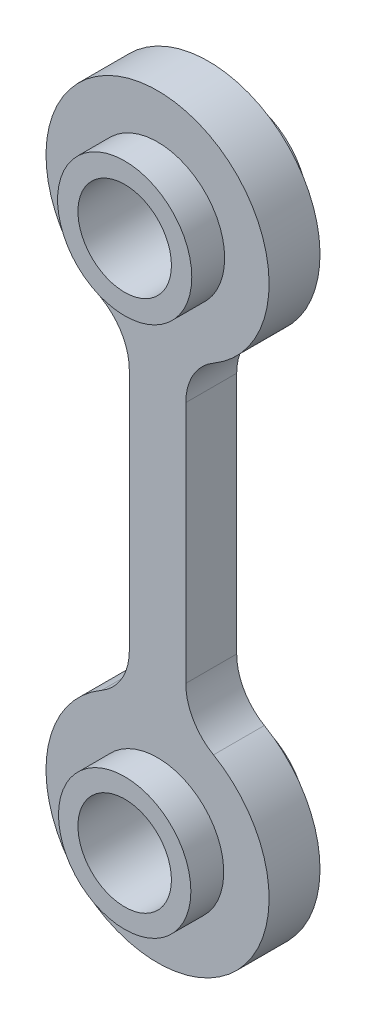
ISO-10303-21;
HEADER;
FILE_DESCRIPTION(('STEP AP214'),'2;1');
FILE_NAME('part.step','',(''),(''),'','','');
FILE_SCHEMA(('AUTOMOTIVE_DESIGN { 1 0 10303 214 1 1 1 1 }'));
ENDSEC;
DATA;
#1=APPLICATION_CONTEXT('core data for automotive mechanical design processes');
#2=APPLICATION_PROTOCOL_DEFINITION('international standard','automotive_design',2000,#1);
#3=PRODUCT_CONTEXT('',#1,'mechanical');
#4=PRODUCT('Part','Part','',(#3));
#5=PRODUCT_RELATED_PRODUCT_CATEGORY('part','',(#4));
#6=PRODUCT_DEFINITION_FORMATION('','',#4);
#7=PRODUCT_DEFINITION_CONTEXT('part definition',#1,'design');
#8=PRODUCT_DEFINITION('design','',#6,#7);
#9=PRODUCT_DEFINITION_SHAPE('','',#8);
#10=(LENGTH_UNIT() NAMED_UNIT(*) SI_UNIT(.MILLI.,.METRE.));
#11=(NAMED_UNIT(*) PLANE_ANGLE_UNIT() SI_UNIT($,.RADIAN.));
#12=(NAMED_UNIT(*) SI_UNIT($,.STERADIAN.) SOLID_ANGLE_UNIT());
#13=UNCERTAINTY_MEASURE_WITH_UNIT(LENGTH_MEASURE(1.E-05),#10,'distance_accuracy_value','');
#14=(GEOMETRIC_REPRESENTATION_CONTEXT(3) GLOBAL_UNCERTAINTY_ASSIGNED_CONTEXT((#13)) GLOBAL_UNIT_ASSIGNED_CONTEXT((#10,
#11,#12)) REPRESENTATION_CONTEXT('',''));
#15=CARTESIAN_POINT('',(0.,0.,0.));
#16=DIRECTION('',(0.,0.,1.));
#17=DIRECTION('',(1.,0.,0.));
#18=AXIS2_PLACEMENT_3D('',#15,#16,#17);
#19=CARTESIAN_POINT('',(0.,0.,12.6));
#20=DIRECTION('',(0.,0.,-1.));
#21=DIRECTION('',(-1.,0.,0.));
#22=AXIS2_PLACEMENT_3D('',#19,#20,#21);
#23=CYLINDRICAL_SURFACE('',#22,7.15);
#24=CARTESIAN_POINT('',(0.,0.,0.));
#25=DIRECTION('',(0.,0.,1.));
#26=DIRECTION('',(1.,0.,0.));
#27=AXIS2_PLACEMENT_3D('',#24,#25,#26);
#28=CIRCLE('',#27,7.15);
#29=CARTESIAN_POINT('',(7.15,0.,0.));
#30=VERTEX_POINT('',#29);
#31=EDGE_CURVE('E212',#30,#30,#28,.T.);
#32=ORIENTED_EDGE('',*,*,#31,.T.);
#33=EDGE_LOOP('',(#32));
#34=FACE_BOUND('',#33,.T.);
#35=CARTESIAN_POINT('',(0.,0.,3.55));
#36=DIRECTION('',(0.,0.,1.));
#37=DIRECTION('',(1.,0.,0.));
#38=AXIS2_PLACEMENT_3D('',#35,#36,#37);
#39=CIRCLE('',#38,7.15);
#40=CARTESIAN_POINT('',(7.15,0.,3.55));
#41=VERTEX_POINT('',#40);
#42=EDGE_CURVE('E48',#41,#41,#39,.T.);
#43=ORIENTED_EDGE('',*,*,#42,.F.);
#44=EDGE_LOOP('',(#43));
#45=FACE_BOUND('',#44,.T.);
#46=ADVANCED_FACE('F39',(#34,#45),#23,.T.);
#47=CARTESIAN_POINT('',(0.,0.,12.6));
#48=DIRECTION('',(0.,0.,1.));
#49=DIRECTION('',(1.,0.,0.));
#50=AXIS2_PLACEMENT_3D('',#47,#48,#49);
#51=PLANE('',#50);
#52=CARTESIAN_POINT('',(0.,0.,12.6));
#53=DIRECTION('',(0.,0.,1.));
#54=DIRECTION('',(1.,0.,0.));
#55=AXIS2_PLACEMENT_3D('',#52,#53,#54);
#56=CIRCLE('',#55,7.15);
#57=CARTESIAN_POINT('',(7.15,0.,12.6));
#58=VERTEX_POINT('',#57);
#59=EDGE_CURVE('E216',#58,#58,#56,.T.);
#60=ORIENTED_EDGE('',*,*,#59,.T.);
#61=EDGE_LOOP('',(#60));
#62=FACE_BOUND('',#61,.T.);
#63=CARTESIAN_POINT('',(0.,0.,12.6));
#64=DIRECTION('',(0.,0.,1.));
#65=DIRECTION('',(1.,0.,0.));
#66=AXIS2_PLACEMENT_3D('',#63,#64,#65);
#67=CIRCLE('',#66,5.05);
#68=CARTESIAN_POINT('',(5.05,0.,12.6));
#69=VERTEX_POINT('',#68);
#70=EDGE_CURVE('E208',#69,#69,#67,.T.);
#71=ORIENTED_EDGE('',*,*,#70,.F.);
#72=EDGE_LOOP('',(#71));
#73=FACE_BOUND('',#72,.T.);
#74=ADVANCED_FACE('F227',(#62,#73),#51,.T.);
#75=CARTESIAN_POINT('',(0.,0.,0.));
#76=DIRECTION('',(0.,0.,1.));
#77=DIRECTION('',(1.,0.,0.));
#78=AXIS2_PLACEMENT_3D('',#75,#76,#77);
#79=PLANE('',#78);
#80=ORIENTED_EDGE('',*,*,#31,.F.);
#81=EDGE_LOOP('',(#80));
#82=FACE_BOUND('',#81,.T.);
#83=CARTESIAN_POINT('',(0.,0.,0.));
#84=DIRECTION('',(0.,0.,1.));
#85=DIRECTION('',(1.,0.,0.));
#86=AXIS2_PLACEMENT_3D('',#83,#84,#85);
#87=CIRCLE('',#86,5.05);
#88=CARTESIAN_POINT('',(5.05,0.,0.));
#89=VERTEX_POINT('',#88);
#90=EDGE_CURVE('E191',#89,#89,#87,.T.);
#91=ORIENTED_EDGE('',*,*,#90,.T.);
#92=EDGE_LOOP('',(#91));
#93=FACE_BOUND('',#92,.T.);
#94=ADVANCED_FACE('F232',(#82,#93),#79,.F.);
#95=CARTESIAN_POINT('',(0.,0.,9.05));
#96=DIRECTION('',(0.,0.,-1.));
#97=DIRECTION('',(-1.,0.,0.));
#98=AXIS2_PLACEMENT_3D('',#95,#96,#97);
#99=CIRCLE('',#98,7.15);
#100=CARTESIAN_POINT('',(-7.15,0.,9.05));
#101=VERTEX_POINT('',#100);
#102=EDGE_CURVE('E159',#101,#101,#99,.T.);
#103=ORIENTED_EDGE('',*,*,#102,.F.);
#104=EDGE_LOOP('',(#103));
#105=FACE_BOUND('',#104,.T.);
#106=ORIENTED_EDGE('',*,*,#59,.F.);
#107=EDGE_LOOP('',(#106));
#108=FACE_BOUND('',#107,.T.);
#109=ADVANCED_FACE('F41',(#105,#108),#23,.T.);
#110=CARTESIAN_POINT('',(0.,0.,12.6));
#111=DIRECTION('',(0.,0.,-1.));
#112=DIRECTION('',(-1.,0.,0.));
#113=AXIS2_PLACEMENT_3D('',#110,#111,#112);
#114=CYLINDRICAL_SURFACE('',#113,5.05);
#115=ORIENTED_EDGE('',*,*,#70,.T.);
#116=EDGE_LOOP('',(#115));
#117=FACE_BOUND('',#116,.T.);
#118=ORIENTED_EDGE('',*,*,#90,.F.);
#119=EDGE_LOOP('',(#118));
#120=FACE_BOUND('',#119,.T.);
#121=ADVANCED_FACE('F236',(#117,#120),#114,.F.);
#122=CARTESIAN_POINT('',(-9.05,41.8827018982156,9.05));
#123=DIRECTION('',(0.,0.,-1.));
#124=DIRECTION('',(-1.,0.,0.));
#125=AXIS2_PLACEMENT_3D('',#122,#123,#124);
#126=CYLINDRICAL_SURFACE('',#125,6.);
#127=DIRECTION('',(0.,0.,-1.));
#128=VECTOR('',#127,1.);
#129=CARTESIAN_POINT('',(-6.04168975069252,47.0740475276176,9.05));
#130=LINE('',#129,#128);
#131=CARTESIAN_POINT('',(-6.04168975069252,47.0740475276176,9.05));
#132=VERTEX_POINT('',#131);
#133=CARTESIAN_POINT('',(-6.04168975069252,47.0740475276176,3.55));
#134=VERTEX_POINT('',#133);
#135=EDGE_CURVE('E104',#132,#134,#130,.T.);
#136=ORIENTED_EDGE('',*,*,#135,.T.);
#137=CARTESIAN_POINT('',(-9.05,41.8827018982156,3.55));
#138=DIRECTION('',(0.,0.,1.));
#139=DIRECTION('',(1.,0.,0.));
#140=AXIS2_PLACEMENT_3D('',#137,#138,#139);
#141=CIRCLE('',#140,6.);
#142=CARTESIAN_POINT('',(-3.05,41.8827018982156,3.55));
#143=VERTEX_POINT('',#142);
#144=EDGE_CURVE('E108',#143,#134,#141,.T.);
#145=ORIENTED_EDGE('',*,*,#144,.F.);
#146=DIRECTION('',(0.,0.,-1.));
#147=VECTOR('',#146,1.);
#148=CARTESIAN_POINT('',(-3.05,41.8827018982156,9.05));
#149=LINE('',#148,#147);
#150=CARTESIAN_POINT('',(-3.05,41.8827018982156,9.05));
#151=VERTEX_POINT('',#150);
#152=EDGE_CURVE('E55',#151,#143,#149,.T.);
#153=ORIENTED_EDGE('',*,*,#152,.F.);
#154=CARTESIAN_POINT('',(-9.05,41.8827018982156,9.05));
#155=DIRECTION('',(0.,0.,1.));
#156=DIRECTION('',(1.,0.,0.));
#157=AXIS2_PLACEMENT_3D('',#154,#155,#156);
#158=CIRCLE('',#157,6.);
#159=EDGE_CURVE('E109',#151,#132,#158,.T.);
#160=ORIENTED_EDGE('',*,*,#159,.T.);
#161=EDGE_LOOP('',(#136,#145,#153,#160));
#162=FACE_BOUND('',#161,.T.);
#163=ADVANCED_FACE('F106',(#162),#126,.F.);
#164=CARTESIAN_POINT('',(-3.05,15.6172981017844,9.05));
#165=DIRECTION('',(-1.,0.,0.));
#166=DIRECTION('',(0.,0.,1.));
#167=AXIS2_PLACEMENT_3D('',#164,#165,#166);
#168=PLANE('',#167);
#169=ORIENTED_EDGE('',*,*,#152,.T.);
#170=DIRECTION('',(0.,1.,0.));
#171=VECTOR('',#170,1.);
#172=CARTESIAN_POINT('',(-3.05,15.6172981017844,3.55));
#173=LINE('',#172,#171);
#174=CARTESIAN_POINT('',(-3.05,15.6172981017844,3.55));
#175=VERTEX_POINT('',#174);
#176=EDGE_CURVE('E130',#175,#143,#173,.T.);
#177=ORIENTED_EDGE('',*,*,#176,.F.);
#178=DIRECTION('',(0.,0.,-1.));
#179=VECTOR('',#178,1.);
#180=CARTESIAN_POINT('',(-3.05,15.6172981017844,9.05));
#181=LINE('',#180,#179);
#182=CARTESIAN_POINT('',(-3.05,15.6172981017844,9.05));
#183=VERTEX_POINT('',#182);
#184=EDGE_CURVE('E63',#183,#175,#181,.T.);
#185=ORIENTED_EDGE('',*,*,#184,.F.);
#186=DIRECTION('',(0.,1.,0.));
#187=VECTOR('',#186,1.);
#188=CARTESIAN_POINT('',(-3.05,15.6172981017844,9.05));
#189=LINE('',#188,#187);
#190=EDGE_CURVE('E115',#183,#151,#189,.T.);
#191=ORIENTED_EDGE('',*,*,#190,.T.);
#192=EDGE_LOOP('',(#169,#177,#185,#191));
#193=FACE_BOUND('',#192,.T.);
#194=ADVANCED_FACE('F262',(#193),#168,.T.);
#195=CARTESIAN_POINT('',(-9.05,15.6172981017844,9.05));
#196=DIRECTION('',(0.,0.,-1.));
#197=DIRECTION('',(-1.,0.,0.));
#198=AXIS2_PLACEMENT_3D('',#195,#196,#197);
#199=CYLINDRICAL_SURFACE('',#198,6.);
#200=ORIENTED_EDGE('',*,*,#184,.T.);
#201=CARTESIAN_POINT('',(-9.05,15.6172981017844,3.55));
#202=DIRECTION('',(0.,0.,1.));
#203=DIRECTION('',(-1.,0.,0.));
#204=AXIS2_PLACEMENT_3D('',#201,#202,#203);
#205=CIRCLE('',#204,6.);
#206=CARTESIAN_POINT('',(-6.04168975069252,10.4259524723824,3.55));
#207=VERTEX_POINT('',#206);
#208=EDGE_CURVE('E154',#207,#175,#205,.T.);
#209=ORIENTED_EDGE('',*,*,#208,.F.);
#210=DIRECTION('',(0.,0.,-1.));
#211=VECTOR('',#210,1.);
#212=CARTESIAN_POINT('',(-6.04168975069252,10.4259524723824,9.05));
#213=LINE('',#212,#211);
#214=CARTESIAN_POINT('',(-6.04168975069252,10.4259524723824,9.05));
#215=VERTEX_POINT('',#214);
#216=EDGE_CURVE('E194',#215,#207,#213,.T.);
#217=ORIENTED_EDGE('',*,*,#216,.F.);
#218=CARTESIAN_POINT('',(-9.05,15.6172981017844,9.05));
#219=DIRECTION('',(0.,0.,1.));
#220=DIRECTION('',(-1.,0.,0.));
#221=AXIS2_PLACEMENT_3D('',#218,#219,#220);
#222=CIRCLE('',#221,6.);
#223=EDGE_CURVE('E184',#215,#183,#222,.T.);
#224=ORIENTED_EDGE('',*,*,#223,.T.);
#225=EDGE_LOOP('',(#200,#209,#217,#224));
#226=FACE_BOUND('',#225,.T.);
#227=ADVANCED_FACE('F264',(#226),#199,.F.);
#228=CARTESIAN_POINT('',(0.,0.,9.05));
#229=DIRECTION('',(0.,0.,-1.));
#230=DIRECTION('',(-1.,0.,0.));
#231=AXIS2_PLACEMENT_3D('',#228,#229,#230);
#232=CYLINDRICAL_SURFACE('',#231,12.05);
#233=ORIENTED_EDGE('',*,*,#216,.T.);
#234=CARTESIAN_POINT('',(0.,0.,3.55));
#235=DIRECTION('',(0.,0.,-1.));
#236=DIRECTION('',(-1.,0.,0.));
#237=AXIS2_PLACEMENT_3D('',#234,#235,#236);
#238=CIRCLE('',#237,12.05);
#239=CARTESIAN_POINT('',(6.04168975069252,10.4259524723824,3.55));
#240=VERTEX_POINT('',#239);
#241=EDGE_CURVE('E150',#240,#207,#238,.T.);
#242=ORIENTED_EDGE('',*,*,#241,.F.);
#243=DIRECTION('',(0.,0.,-1.));
#244=VECTOR('',#243,1.);
#245=CARTESIAN_POINT('',(6.04168975069252,10.4259524723824,9.05));
#246=LINE('',#245,#244);
#247=CARTESIAN_POINT('',(6.04168975069252,10.4259524723824,9.05));
#248=VERTEX_POINT('',#247);
#249=EDGE_CURVE('E197',#248,#240,#246,.T.);
#250=ORIENTED_EDGE('',*,*,#249,.F.);
#251=CARTESIAN_POINT('',(0.,0.,9.05));
#252=DIRECTION('',(0.,0.,-1.));
#253=DIRECTION('',(-1.,0.,0.));
#254=AXIS2_PLACEMENT_3D('',#251,#252,#253);
#255=CIRCLE('',#254,12.05);
#256=EDGE_CURVE('E180',#248,#215,#255,.T.);
#257=ORIENTED_EDGE('',*,*,#256,.T.);
#258=EDGE_LOOP('',(#233,#242,#250,#257));
#259=FACE_BOUND('',#258,.T.);
#260=ADVANCED_FACE('F270',(#259),#232,.T.);
#261=CARTESIAN_POINT('',(9.05,15.6172981017844,9.05));
#262=DIRECTION('',(0.,0.,-1.));
#263=DIRECTION('',(-1.,0.,0.));
#264=AXIS2_PLACEMENT_3D('',#261,#262,#263);
#265=CYLINDRICAL_SURFACE('',#264,6.);
#266=ORIENTED_EDGE('',*,*,#249,.T.);
#267=CARTESIAN_POINT('',(9.05,15.6172981017844,3.55));
#268=DIRECTION('',(0.,0.,1.));
#269=DIRECTION('',(1.,0.,0.));
#270=AXIS2_PLACEMENT_3D('',#267,#268,#269);
#271=CIRCLE('',#270,6.);
#272=CARTESIAN_POINT('',(3.05,15.6172981017844,3.55));
#273=VERTEX_POINT('',#272);
#274=EDGE_CURVE('E146',#273,#240,#271,.T.);
#275=ORIENTED_EDGE('',*,*,#274,.F.);
#276=DIRECTION('',(0.,0.,-1.));
#277=VECTOR('',#276,1.);
#278=CARTESIAN_POINT('',(3.05,15.6172981017844,9.05));
#279=LINE('',#278,#277);
#280=CARTESIAN_POINT('',(3.05,15.6172981017844,9.05));
#281=VERTEX_POINT('',#280);
#282=EDGE_CURVE('E200',#281,#273,#279,.T.);
#283=ORIENTED_EDGE('',*,*,#282,.F.);
#284=CARTESIAN_POINT('',(9.05,15.6172981017844,9.05));
#285=DIRECTION('',(0.,0.,1.));
#286=DIRECTION('',(1.,0.,0.));
#287=AXIS2_PLACEMENT_3D('',#284,#285,#286);
#288=CIRCLE('',#287,6.);
#289=EDGE_CURVE('E176',#281,#248,#288,.T.);
#290=ORIENTED_EDGE('',*,*,#289,.T.);
#291=EDGE_LOOP('',(#266,#275,#283,#290));
#292=FACE_BOUND('',#291,.T.);
#293=ADVANCED_FACE('F278',(#292),#265,.F.);
#294=CARTESIAN_POINT('',(3.05,15.6172981017844,9.05));
#295=DIRECTION('',(1.,0.,0.));
#296=DIRECTION('',(0.,0.,-1.));
#297=AXIS2_PLACEMENT_3D('',#294,#295,#296);
#298=PLANE('',#297);
#299=ORIENTED_EDGE('',*,*,#282,.T.);
#300=DIRECTION('',(0.,-1.,0.));
#301=VECTOR('',#300,1.);
#302=CARTESIAN_POINT('',(3.05,15.6172981017844,3.55));
#303=LINE('',#302,#301);
#304=CARTESIAN_POINT('',(3.05,41.8827018982156,3.55));
#305=VERTEX_POINT('',#304);
#306=EDGE_CURVE('E142',#305,#273,#303,.T.);
#307=ORIENTED_EDGE('',*,*,#306,.F.);
#308=DIRECTION('',(0.,0.,-1.));
#309=VECTOR('',#308,1.);
#310=CARTESIAN_POINT('',(3.05,41.8827018982156,9.05));
#311=LINE('',#310,#309);
#312=CARTESIAN_POINT('',(3.05,41.8827018982156,9.05));
#313=VERTEX_POINT('',#312);
#314=EDGE_CURVE('E203',#313,#305,#311,.T.);
#315=ORIENTED_EDGE('',*,*,#314,.F.);
#316=DIRECTION('',(0.,-1.,0.));
#317=VECTOR('',#316,1.);
#318=CARTESIAN_POINT('',(3.05,15.6172981017844,9.05));
#319=LINE('',#318,#317);
#320=EDGE_CURVE('E172',#313,#281,#319,.T.);
#321=ORIENTED_EDGE('',*,*,#320,.T.);
#322=EDGE_LOOP('',(#299,#307,#315,#321));
#323=FACE_BOUND('',#322,.T.);
#324=ADVANCED_FACE('F282',(#323),#298,.T.);
#325=CARTESIAN_POINT('',(9.05,41.8827018982156,9.05));
#326=DIRECTION('',(0.,0.,-1.));
#327=DIRECTION('',(-1.,0.,0.));
#328=AXIS2_PLACEMENT_3D('',#325,#326,#327);
#329=CYLINDRICAL_SURFACE('',#328,6.);
#330=ORIENTED_EDGE('',*,*,#314,.T.);
#331=CARTESIAN_POINT('',(9.05,41.8827018982156,3.55));
#332=DIRECTION('',(0.,0.,1.));
#333=DIRECTION('',(-1.,0.,0.));
#334=AXIS2_PLACEMENT_3D('',#331,#332,#333);
#335=CIRCLE('',#334,6.);
#336=CARTESIAN_POINT('',(6.04168975069252,47.0740475276176,3.55));
#337=VERTEX_POINT('',#336);
#338=EDGE_CURVE('E124',#337,#305,#335,.T.);
#339=ORIENTED_EDGE('',*,*,#338,.F.);
#340=DIRECTION('',(0.,0.,-1.));
#341=VECTOR('',#340,1.);
#342=CARTESIAN_POINT('',(6.04168975069252,47.0740475276176,9.05));
#343=LINE('',#342,#341);
#344=CARTESIAN_POINT('',(6.04168975069252,47.0740475276176,9.05));
#345=VERTEX_POINT('',#344);
#346=EDGE_CURVE('E114',#345,#337,#343,.T.);
#347=ORIENTED_EDGE('',*,*,#346,.F.);
#348=CARTESIAN_POINT('',(9.05,41.8827018982156,9.05));
#349=DIRECTION('',(0.,0.,1.));
#350=DIRECTION('',(-1.,0.,0.));
#351=AXIS2_PLACEMENT_3D('',#348,#349,#350);
#352=CIRCLE('',#351,6.);
#353=EDGE_CURVE('E168',#345,#313,#352,.T.);
#354=ORIENTED_EDGE('',*,*,#353,.T.);
#355=EDGE_LOOP('',(#330,#339,#347,#354));
#356=FACE_BOUND('',#355,.T.);
#357=ADVANCED_FACE('F286',(#356),#329,.F.);
#358=CARTESIAN_POINT('',(0.,57.5,9.05));
#359=DIRECTION('',(0.,0.,-1.));
#360=DIRECTION('',(-1.,0.,0.));
#361=AXIS2_PLACEMENT_3D('',#358,#359,#360);
#362=CYLINDRICAL_SURFACE('',#361,12.05);
#363=ORIENTED_EDGE('',*,*,#346,.T.);
#364=CARTESIAN_POINT('',(0.,57.5,3.55));
#365=DIRECTION('',(0.,0.,-1.));
#366=DIRECTION('',(-1.,0.,0.));
#367=AXIS2_PLACEMENT_3D('',#364,#365,#366);
#368=CIRCLE('',#367,12.05);
#369=EDGE_CURVE('E118',#134,#337,#368,.T.);
#370=ORIENTED_EDGE('',*,*,#369,.F.);
#371=ORIENTED_EDGE('',*,*,#135,.F.);
#372=CARTESIAN_POINT('',(0.,57.5,9.05));
#373=DIRECTION('',(0.,0.,-1.));
#374=DIRECTION('',(-1.,0.,0.));
#375=AXIS2_PLACEMENT_3D('',#372,#373,#374);
#376=CIRCLE('',#375,12.05);
#377=EDGE_CURVE('E165',#132,#345,#376,.T.);
#378=ORIENTED_EDGE('',*,*,#377,.T.);
#379=EDGE_LOOP('',(#363,#370,#371,#378));
#380=FACE_BOUND('',#379,.T.);
#381=ADVANCED_FACE('F119',(#380),#362,.T.);
#382=CARTESIAN_POINT('',(-9.05,41.8827018982156,9.05));
#383=DIRECTION('',(0.,0.,1.));
#384=DIRECTION('',(1.,0.,0.));
#385=AXIS2_PLACEMENT_3D('',#382,#383,#384);
#386=PLANE('',#385);
#387=CARTESIAN_POINT('',(0.,57.5,9.05));
#388=DIRECTION('',(0.,0.,1.));
#389=DIRECTION('',(1.,0.,0.));
#390=AXIS2_PLACEMENT_3D('',#387,#388,#389);
#391=CIRCLE('',#390,7.24821144655609);
#392=CARTESIAN_POINT('',(7.24821144655609,57.5,9.05));
#393=VERTEX_POINT('',#392);
#394=EDGE_CURVE('E132',#393,#393,#391,.F.);
#395=ORIENTED_EDGE('',*,*,#394,.T.);
#396=EDGE_LOOP('',(#395));
#397=FACE_BOUND('',#396,.T.);
#398=ORIENTED_EDGE('',*,*,#102,.T.);
#399=EDGE_LOOP('',(#398));
#400=FACE_BOUND('',#399,.T.);
#401=ORIENTED_EDGE('',*,*,#159,.F.);
#402=ORIENTED_EDGE('',*,*,#190,.F.);
#403=ORIENTED_EDGE('',*,*,#223,.F.);
#404=ORIENTED_EDGE('',*,*,#256,.F.);
#405=ORIENTED_EDGE('',*,*,#289,.F.);
#406=ORIENTED_EDGE('',*,*,#320,.F.);
#407=ORIENTED_EDGE('',*,*,#353,.F.);
#408=ORIENTED_EDGE('',*,*,#377,.F.);
#409=EDGE_LOOP('',(#401,#402,#403,#404,#405,#406,#407,#408));
#410=FACE_BOUND('',#409,.T.);
#411=ADVANCED_FACE('F254',(#397,#400,#410),#386,.T.);
#412=CARTESIAN_POINT('',(-9.05,41.8827018982156,3.55));
#413=DIRECTION('',(0.,0.,1.));
#414=DIRECTION('',(1.,0.,0.));
#415=AXIS2_PLACEMENT_3D('',#412,#413,#414);
#416=PLANE('',#415);
#417=CARTESIAN_POINT('',(0.,57.5,3.55));
#418=DIRECTION('',(0.,0.,1.));
#419=DIRECTION('',(1.,0.,0.));
#420=AXIS2_PLACEMENT_3D('',#417,#418,#419);
#421=CIRCLE('',#420,7.24821144655609);
#422=CARTESIAN_POINT('',(7.24821144655609,57.5,3.55));
#423=VERTEX_POINT('',#422);
#424=EDGE_CURVE('E11',#423,#423,#421,.F.);
#425=ORIENTED_EDGE('',*,*,#424,.F.);
#426=EDGE_LOOP('',(#425));
#427=FACE_BOUND('',#426,.T.);
#428=ORIENTED_EDGE('',*,*,#144,.T.);
#429=ORIENTED_EDGE('',*,*,#369,.T.);
#430=ORIENTED_EDGE('',*,*,#338,.T.);
#431=ORIENTED_EDGE('',*,*,#306,.T.);
#432=ORIENTED_EDGE('',*,*,#274,.T.);
#433=ORIENTED_EDGE('',*,*,#241,.T.);
#434=ORIENTED_EDGE('',*,*,#208,.T.);
#435=ORIENTED_EDGE('',*,*,#176,.T.);
#436=EDGE_LOOP('',(#428,#429,#430,#431,#432,#433,#434,#435));
#437=FACE_BOUND('',#436,.T.);
#438=ORIENTED_EDGE('',*,*,#42,.T.);
#439=EDGE_LOOP('',(#438));
#440=FACE_BOUND('',#439,.T.);
#441=ADVANCED_FACE('F127',(#427,#437,#440),#416,.F.);
#442=CARTESIAN_POINT('',(0.,57.5,-20.5010378613351));
#443=DIRECTION('',(0.,0.,1.));
#444=DIRECTION('',(1.,0.,0.));
#445=AXIS2_PLACEMENT_3D('',#442,#443,#444);
#446=CYLINDRICAL_SURFACE('',#445,7.24821144655609);
#447=CARTESIAN_POINT('',(0.,57.5,0.));
#448=DIRECTION('',(0.,0.,1.));
#449=DIRECTION('',(1.,0.,0.));
#450=AXIS2_PLACEMENT_3D('',#447,#448,#449);
#451=CIRCLE('',#450,7.24821144655609);
#452=CARTESIAN_POINT('',(7.24821144655609,57.5,0.));
#453=VERTEX_POINT('',#452);
#454=EDGE_CURVE('E436',#453,#453,#451,.T.);
#455=ORIENTED_EDGE('',*,*,#454,.T.);
#456=EDGE_LOOP('',(#455));
#457=FACE_BOUND('',#456,.T.);
#458=ORIENTED_EDGE('',*,*,#424,.T.);
#459=EDGE_LOOP('',(#458));
#460=FACE_BOUND('',#459,.T.);
#461=ADVANCED_FACE('F306',(#457,#460),#446,.T.);
#462=ORIENTED_EDGE('',*,*,#394,.F.);
#463=EDGE_LOOP('',(#462));
#464=FACE_BOUND('',#463,.T.);
#465=CARTESIAN_POINT('',(0.,57.5,12.6));
#466=DIRECTION('',(0.,0.,1.));
#467=DIRECTION('',(1.,0.,0.));
#468=AXIS2_PLACEMENT_3D('',#465,#466,#467);
#469=CIRCLE('',#468,7.24821144655609);
#470=CARTESIAN_POINT('',(7.24821144655609,57.5,12.6));
#471=VERTEX_POINT('',#470);
#472=EDGE_CURVE('E430',#471,#471,#469,.F.);
#473=ORIENTED_EDGE('',*,*,#472,.T.);
#474=EDGE_LOOP('',(#473));
#475=FACE_BOUND('',#474,.T.);
#476=ADVANCED_FACE('F313',(#464,#475),#446,.T.);
#477=CARTESIAN_POINT('',(0.,57.5,-20.5010378613351));
#478=DIRECTION('',(0.,0.,1.));
#479=DIRECTION('',(1.,0.,0.));
#480=AXIS2_PLACEMENT_3D('',#477,#478,#479);
#481=CYLINDRICAL_SURFACE('',#480,5.05);
#482=CARTESIAN_POINT('',(0.,57.5,0.));
#483=DIRECTION('',(0.,0.,1.));
#484=DIRECTION('',(1.,0.,0.));
#485=AXIS2_PLACEMENT_3D('',#482,#483,#484);
#486=CIRCLE('',#485,5.05);
#487=CARTESIAN_POINT('',(5.05,57.5,0.));
#488=VERTEX_POINT('',#487);
#489=EDGE_CURVE('E136',#488,#488,#486,.T.);
#490=ORIENTED_EDGE('',*,*,#489,.F.);
#491=EDGE_LOOP('',(#490));
#492=FACE_BOUND('',#491,.T.);
#493=CARTESIAN_POINT('',(0.,57.5,12.6));
#494=DIRECTION('',(0.,0.,1.));
#495=DIRECTION('',(1.,0.,0.));
#496=AXIS2_PLACEMENT_3D('',#493,#494,#495);
#497=CIRCLE('',#496,5.05);
#498=CARTESIAN_POINT('',(5.05,57.5,12.6));
#499=VERTEX_POINT('',#498);
#500=EDGE_CURVE('E433',#499,#499,#497,.F.);
#501=ORIENTED_EDGE('',*,*,#500,.F.);
#502=EDGE_LOOP('',(#501));
#503=FACE_BOUND('',#502,.T.);
#504=ADVANCED_FACE('F321',(#492,#503),#481,.F.);
#505=CARTESIAN_POINT('',(0.,0.,0.));
#506=DIRECTION('',(0.,0.,1.));
#507=DIRECTION('',(1.,0.,0.));
#508=AXIS2_PLACEMENT_3D('',#505,#506,#507);
#509=PLANE('',#508);
#510=ORIENTED_EDGE('',*,*,#489,.T.);
#511=EDGE_LOOP('',(#510));
#512=FACE_BOUND('',#511,.T.);
#513=ORIENTED_EDGE('',*,*,#454,.F.);
#514=EDGE_LOOP('',(#513));
#515=FACE_BOUND('',#514,.T.);
#516=ADVANCED_FACE('F328',(#512,#515),#509,.F.);
#517=CARTESIAN_POINT('',(0.,0.,12.6));
#518=DIRECTION('',(0.,0.,1.));
#519=DIRECTION('',(1.,0.,0.));
#520=AXIS2_PLACEMENT_3D('',#517,#518,#519);
#521=PLANE('',#520);
#522=ORIENTED_EDGE('',*,*,#472,.F.);
#523=EDGE_LOOP('',(#522));
#524=FACE_BOUND('',#523,.T.);
#525=ORIENTED_EDGE('',*,*,#500,.T.);
#526=EDGE_LOOP('',(#525));
#527=FACE_BOUND('',#526,.T.);
#528=ADVANCED_FACE('F336',(#524,#527),#521,.T.);
#529=CLOSED_SHELL('',(#46,#74,#94,#109,#121,#163,#194,#227,#260,#293,#324,#357,#381,#411,#441,
#461,#476,#504,#516,#528));
#530=MANIFOLD_SOLID_BREP('B2',#529);
#531=ADVANCED_BREP_SHAPE_REPRESENTATION('',(#18,#530),#14);
#532=SHAPE_DEFINITION_REPRESENTATION(#9,#531);
ENDSEC;
END-ISO-10303-21;
